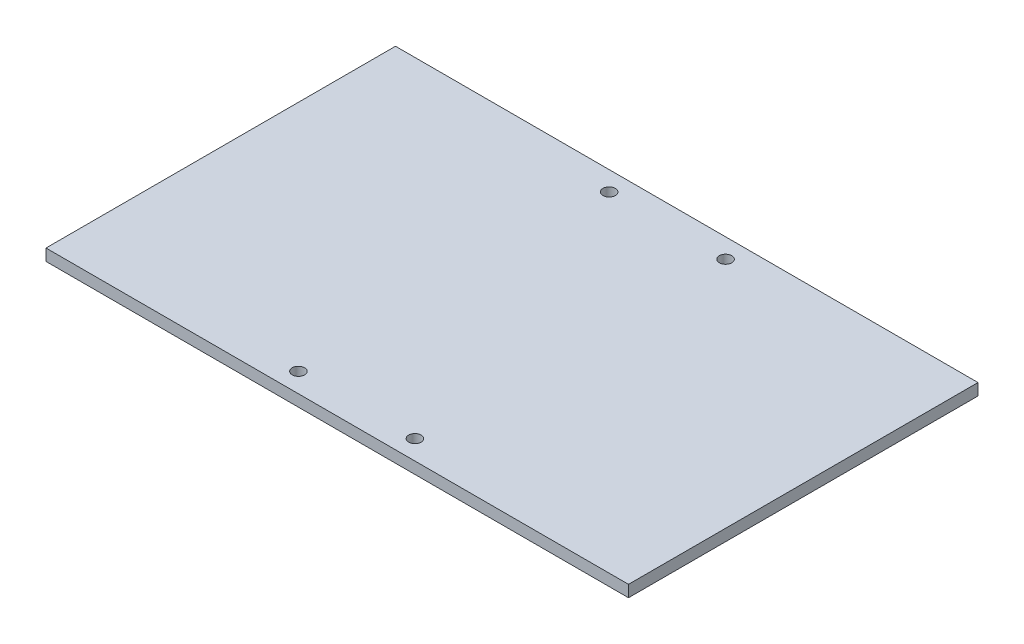
ISO-10303-21;
HEADER;
FILE_DESCRIPTION(('STEP AP214'),'2;1');
FILE_NAME('part.step','',(''),(''),'','','');
FILE_SCHEMA(('AUTOMOTIVE_DESIGN { 1 0 10303 214 1 1 1 1 }'));
ENDSEC;
DATA;
#1=APPLICATION_CONTEXT('core data for automotive mechanical design processes');
#2=APPLICATION_PROTOCOL_DEFINITION('international standard','automotive_design',2000,#1);
#3=PRODUCT_CONTEXT('',#1,'mechanical');
#4=PRODUCT('Part','Part','',(#3));
#5=PRODUCT_RELATED_PRODUCT_CATEGORY('part','',(#4));
#6=PRODUCT_DEFINITION_FORMATION('','',#4);
#7=PRODUCT_DEFINITION_CONTEXT('part definition',#1,'design');
#8=PRODUCT_DEFINITION('design','',#6,#7);
#9=PRODUCT_DEFINITION_SHAPE('','',#8);
#10=(LENGTH_UNIT() NAMED_UNIT(*) SI_UNIT(.MILLI.,.METRE.));
#11=(NAMED_UNIT(*) PLANE_ANGLE_UNIT() SI_UNIT($,.RADIAN.));
#12=(NAMED_UNIT(*) SI_UNIT($,.STERADIAN.) SOLID_ANGLE_UNIT());
#13=UNCERTAINTY_MEASURE_WITH_UNIT(LENGTH_MEASURE(1.E-05),#10,'distance_accuracy_value','');
#14=(GEOMETRIC_REPRESENTATION_CONTEXT(3) GLOBAL_UNCERTAINTY_ASSIGNED_CONTEXT((#13)) GLOBAL_UNIT_ASSIGNED_CONTEXT((#10,
#11,#12)) REPRESENTATION_CONTEXT('',''));
#15=CARTESIAN_POINT('',(0.,0.,0.));
#16=DIRECTION('',(0.,0.,1.));
#17=DIRECTION('',(1.,0.,0.));
#18=AXIS2_PLACEMENT_3D('',#15,#16,#17);
#19=CARTESIAN_POINT('',(0.,3.,0.));
#20=DIRECTION('',(0.,1.,0.));
#21=DIRECTION('',(0.,0.,1.));
#22=AXIS2_PLACEMENT_3D('',#19,#20,#21);
#23=PLANE('',#22);
#24=CARTESIAN_POINT('',(-15.,3.,40.));
#25=DIRECTION('',(0.,1.,0.));
#26=DIRECTION('',(0.,0.,1.));
#27=AXIS2_PLACEMENT_3D('',#24,#25,#26);
#28=CIRCLE('',#27,1.6);
#29=CARTESIAN_POINT('',(-15.,3.,41.6));
#30=VERTEX_POINT('',#29);
#31=EDGE_CURVE('E130',#30,#30,#28,.T.);
#32=ORIENTED_EDGE('',*,*,#31,.F.);
#33=EDGE_LOOP('',(#32));
#34=FACE_BOUND('',#33,.T.);
#35=CARTESIAN_POINT('',(15.,3.,40.));
#36=DIRECTION('',(0.,1.,0.));
#37=DIRECTION('',(0.,0.,1.));
#38=AXIS2_PLACEMENT_3D('',#35,#36,#37);
#39=CIRCLE('',#38,1.6);
#40=CARTESIAN_POINT('',(15.,3.,41.6));
#41=VERTEX_POINT('',#40);
#42=EDGE_CURVE('E106',#41,#41,#39,.T.);
#43=ORIENTED_EDGE('',*,*,#42,.F.);
#44=EDGE_LOOP('',(#43));
#45=FACE_BOUND('',#44,.T.);
#46=DIRECTION('',(0.,0.,-1.));
#47=VECTOR('',#46,1.);
#48=CARTESIAN_POINT('',(75.,3.,-45.));
#49=LINE('',#48,#47);
#50=CARTESIAN_POINT('',(75.,3.,45.));
#51=VERTEX_POINT('',#50);
#52=CARTESIAN_POINT('',(75.,3.,-45.));
#53=VERTEX_POINT('',#52);
#54=EDGE_CURVE('E91',#51,#53,#49,.T.);
#55=ORIENTED_EDGE('',*,*,#54,.T.);
#56=DIRECTION('',(-1.,0.,0.));
#57=VECTOR('',#56,1.);
#58=CARTESIAN_POINT('',(-75.,3.,-45.));
#59=LINE('',#58,#57);
#60=CARTESIAN_POINT('',(-75.,3.,-45.));
#61=VERTEX_POINT('',#60);
#62=EDGE_CURVE('E86',#53,#61,#59,.T.);
#63=ORIENTED_EDGE('',*,*,#62,.T.);
#64=DIRECTION('',(0.,0.,1.));
#65=VECTOR('',#64,1.);
#66=CARTESIAN_POINT('',(-75.,3.,-45.));
#67=LINE('',#66,#65);
#68=CARTESIAN_POINT('',(-75.,3.,45.));
#69=VERTEX_POINT('',#68);
#70=EDGE_CURVE('E87',#61,#69,#67,.T.);
#71=ORIENTED_EDGE('',*,*,#70,.T.);
#72=DIRECTION('',(1.,0.,0.));
#73=VECTOR('',#72,1.);
#74=CARTESIAN_POINT('',(-75.,3.,45.));
#75=LINE('',#74,#73);
#76=EDGE_CURVE('E57',#69,#51,#75,.T.);
#77=ORIENTED_EDGE('',*,*,#76,.T.);
#78=EDGE_LOOP('',(#55,#63,#71,#77));
#79=FACE_BOUND('',#78,.T.);
#80=CARTESIAN_POINT('',(-15.,3.,-40.));
#81=DIRECTION('',(0.,1.,0.));
#82=DIRECTION('',(0.,0.,1.));
#83=AXIS2_PLACEMENT_3D('',#80,#81,#82);
#84=CIRCLE('',#83,1.6);
#85=CARTESIAN_POINT('',(-15.,3.,-38.4));
#86=VERTEX_POINT('',#85);
#87=EDGE_CURVE('E123',#86,#86,#84,.T.);
#88=ORIENTED_EDGE('',*,*,#87,.F.);
#89=EDGE_LOOP('',(#88));
#90=FACE_BOUND('',#89,.T.);
#91=CARTESIAN_POINT('',(15.,3.,-40.));
#92=DIRECTION('',(0.,1.,0.));
#93=DIRECTION('',(0.,0.,1.));
#94=AXIS2_PLACEMENT_3D('',#91,#92,#93);
#95=CIRCLE('',#94,1.6);
#96=CARTESIAN_POINT('',(15.,3.,-38.4));
#97=VERTEX_POINT('',#96);
#98=EDGE_CURVE('E133',#97,#97,#95,.T.);
#99=ORIENTED_EDGE('',*,*,#98,.F.);
#100=EDGE_LOOP('',(#99));
#101=FACE_BOUND('',#100,.T.);
#102=ADVANCED_FACE('F39',(#34,#45,#79,#90,#101),#23,.T.);
#103=CARTESIAN_POINT('',(0.,0.,0.));
#104=DIRECTION('',(0.,1.,0.));
#105=DIRECTION('',(0.,0.,1.));
#106=AXIS2_PLACEMENT_3D('',#103,#104,#105);
#107=PLANE('',#106);
#108=DIRECTION('',(0.,0.,-1.));
#109=VECTOR('',#108,1.);
#110=CARTESIAN_POINT('',(75.,0.,-45.));
#111=LINE('',#110,#109);
#112=CARTESIAN_POINT('',(75.,0.,45.));
#113=VERTEX_POINT('',#112);
#114=CARTESIAN_POINT('',(75.,0.,-45.));
#115=VERTEX_POINT('',#114);
#116=EDGE_CURVE('E104',#113,#115,#111,.T.);
#117=ORIENTED_EDGE('',*,*,#116,.F.);
#118=DIRECTION('',(1.,0.,0.));
#119=VECTOR('',#118,1.);
#120=CARTESIAN_POINT('',(-75.,0.,45.));
#121=LINE('',#120,#119);
#122=CARTESIAN_POINT('',(-75.,0.,45.));
#123=VERTEX_POINT('',#122);
#124=EDGE_CURVE('E80',#123,#113,#121,.T.);
#125=ORIENTED_EDGE('',*,*,#124,.F.);
#126=DIRECTION('',(0.,0.,1.));
#127=VECTOR('',#126,1.);
#128=CARTESIAN_POINT('',(-75.,0.,-45.));
#129=LINE('',#128,#127);
#130=CARTESIAN_POINT('',(-75.,0.,-45.));
#131=VERTEX_POINT('',#130);
#132=EDGE_CURVE('E74',#131,#123,#129,.T.);
#133=ORIENTED_EDGE('',*,*,#132,.F.);
#134=DIRECTION('',(-1.,0.,0.));
#135=VECTOR('',#134,1.);
#136=CARTESIAN_POINT('',(-75.,0.,-45.));
#137=LINE('',#136,#135);
#138=EDGE_CURVE('E94',#115,#131,#137,.T.);
#139=ORIENTED_EDGE('',*,*,#138,.F.);
#140=EDGE_LOOP('',(#117,#125,#133,#139));
#141=FACE_BOUND('',#140,.T.);
#142=CARTESIAN_POINT('',(15.,0.,40.));
#143=DIRECTION('',(0.,1.,0.));
#144=DIRECTION('',(0.,0.,1.));
#145=AXIS2_PLACEMENT_3D('',#142,#143,#144);
#146=CIRCLE('',#145,1.6);
#147=CARTESIAN_POINT('',(15.,0.,41.6));
#148=VERTEX_POINT('',#147);
#149=EDGE_CURVE('E119',#148,#148,#146,.T.);
#150=ORIENTED_EDGE('',*,*,#149,.T.);
#151=EDGE_LOOP('',(#150));
#152=FACE_BOUND('',#151,.T.);
#153=CARTESIAN_POINT('',(-15.,0.,-40.));
#154=DIRECTION('',(0.,1.,0.));
#155=DIRECTION('',(0.,0.,1.));
#156=AXIS2_PLACEMENT_3D('',#153,#154,#155);
#157=CIRCLE('',#156,1.6);
#158=CARTESIAN_POINT('',(-15.,0.,-38.4));
#159=VERTEX_POINT('',#158);
#160=EDGE_CURVE('E125',#159,#159,#157,.T.);
#161=ORIENTED_EDGE('',*,*,#160,.T.);
#162=EDGE_LOOP('',(#161));
#163=FACE_BOUND('',#162,.T.);
#164=CARTESIAN_POINT('',(-15.,0.,40.));
#165=DIRECTION('',(0.,1.,0.));
#166=DIRECTION('',(0.,0.,1.));
#167=AXIS2_PLACEMENT_3D('',#164,#165,#166);
#168=CIRCLE('',#167,1.6);
#169=CARTESIAN_POINT('',(-15.,0.,41.6));
#170=VERTEX_POINT('',#169);
#171=EDGE_CURVE('E127',#170,#170,#168,.T.);
#172=ORIENTED_EDGE('',*,*,#171,.T.);
#173=EDGE_LOOP('',(#172));
#174=FACE_BOUND('',#173,.T.);
#175=CARTESIAN_POINT('',(15.,0.,-40.));
#176=DIRECTION('',(0.,1.,0.));
#177=DIRECTION('',(0.,0.,1.));
#178=AXIS2_PLACEMENT_3D('',#175,#176,#177);
#179=CIRCLE('',#178,1.6);
#180=CARTESIAN_POINT('',(15.,0.,-38.4));
#181=VERTEX_POINT('',#180);
#182=EDGE_CURVE('E136',#181,#181,#179,.T.);
#183=ORIENTED_EDGE('',*,*,#182,.T.);
#184=EDGE_LOOP('',(#183));
#185=FACE_BOUND('',#184,.T.);
#186=ADVANCED_FACE('F114',(#141,#152,#163,#174,#185),#107,.F.);
#187=CARTESIAN_POINT('',(75.,3.,-45.));
#188=DIRECTION('',(-1.,0.,0.));
#189=DIRECTION('',(0.,0.,1.));
#190=AXIS2_PLACEMENT_3D('',#187,#188,#189);
#191=PLANE('',#190);
#192=ORIENTED_EDGE('',*,*,#116,.T.);
#193=DIRECTION('',(0.,-1.,0.));
#194=VECTOR('',#193,1.);
#195=CARTESIAN_POINT('',(75.,3.,-45.));
#196=LINE('',#195,#194);
#197=EDGE_CURVE('E11',#53,#115,#196,.T.);
#198=ORIENTED_EDGE('',*,*,#197,.F.);
#199=ORIENTED_EDGE('',*,*,#54,.F.);
#200=DIRECTION('',(0.,-1.,0.));
#201=VECTOR('',#200,1.);
#202=CARTESIAN_POINT('',(75.,3.,45.));
#203=LINE('',#202,#201);
#204=EDGE_CURVE('E98',#51,#113,#203,.T.);
#205=ORIENTED_EDGE('',*,*,#204,.T.);
#206=EDGE_LOOP('',(#192,#198,#199,#205));
#207=FACE_BOUND('',#206,.T.);
#208=ADVANCED_FACE('F41',(#207),#191,.F.);
#209=CARTESIAN_POINT('',(-75.,3.,-45.));
#210=DIRECTION('',(0.,0.,1.));
#211=DIRECTION('',(1.,0.,0.));
#212=AXIS2_PLACEMENT_3D('',#209,#210,#211);
#213=PLANE('',#212);
#214=ORIENTED_EDGE('',*,*,#138,.T.);
#215=DIRECTION('',(0.,-1.,0.));
#216=VECTOR('',#215,1.);
#217=CARTESIAN_POINT('',(-75.,3.,-45.));
#218=LINE('',#217,#216);
#219=EDGE_CURVE('E48',#61,#131,#218,.T.);
#220=ORIENTED_EDGE('',*,*,#219,.F.);
#221=ORIENTED_EDGE('',*,*,#62,.F.);
#222=ORIENTED_EDGE('',*,*,#197,.T.);
#223=EDGE_LOOP('',(#214,#220,#221,#222));
#224=FACE_BOUND('',#223,.T.);
#225=ADVANCED_FACE('F92',(#224),#213,.F.);
#226=CARTESIAN_POINT('',(-75.,3.,-45.));
#227=DIRECTION('',(1.,0.,0.));
#228=DIRECTION('',(0.,0.,-1.));
#229=AXIS2_PLACEMENT_3D('',#226,#227,#228);
#230=PLANE('',#229);
#231=ORIENTED_EDGE('',*,*,#132,.T.);
#232=DIRECTION('',(0.,-1.,0.));
#233=VECTOR('',#232,1.);
#234=CARTESIAN_POINT('',(-75.,3.,45.));
#235=LINE('',#234,#233);
#236=EDGE_CURVE('E96',#69,#123,#235,.T.);
#237=ORIENTED_EDGE('',*,*,#236,.F.);
#238=ORIENTED_EDGE('',*,*,#70,.F.);
#239=ORIENTED_EDGE('',*,*,#219,.T.);
#240=EDGE_LOOP('',(#231,#237,#238,#239));
#241=FACE_BOUND('',#240,.T.);
#242=ADVANCED_FACE('F100',(#241),#230,.F.);
#243=CARTESIAN_POINT('',(-75.,3.,45.));
#244=DIRECTION('',(0.,0.,-1.));
#245=DIRECTION('',(-1.,0.,0.));
#246=AXIS2_PLACEMENT_3D('',#243,#244,#245);
#247=PLANE('',#246);
#248=ORIENTED_EDGE('',*,*,#124,.T.);
#249=ORIENTED_EDGE('',*,*,#204,.F.);
#250=ORIENTED_EDGE('',*,*,#76,.F.);
#251=ORIENTED_EDGE('',*,*,#236,.T.);
#252=EDGE_LOOP('',(#248,#249,#250,#251));
#253=FACE_BOUND('',#252,.T.);
#254=ADVANCED_FACE('F112',(#253),#247,.F.);
#255=CARTESIAN_POINT('',(15.,3.,40.));
#256=DIRECTION('',(0.,-1.,0.));
#257=DIRECTION('',(0.,0.,-1.));
#258=AXIS2_PLACEMENT_3D('',#255,#256,#257);
#259=CYLINDRICAL_SURFACE('',#258,1.6);
#260=ORIENTED_EDGE('',*,*,#42,.T.);
#261=EDGE_LOOP('',(#260));
#262=FACE_BOUND('',#261,.T.);
#263=ORIENTED_EDGE('',*,*,#149,.F.);
#264=EDGE_LOOP('',(#263));
#265=FACE_BOUND('',#264,.T.);
#266=ADVANCED_FACE('F155',(#262,#265),#259,.F.);
#267=CARTESIAN_POINT('',(-15.,3.,-40.));
#268=DIRECTION('',(0.,-1.,0.));
#269=DIRECTION('',(0.,0.,-1.));
#270=AXIS2_PLACEMENT_3D('',#267,#268,#269);
#271=CYLINDRICAL_SURFACE('',#270,1.6);
#272=ORIENTED_EDGE('',*,*,#87,.T.);
#273=EDGE_LOOP('',(#272));
#274=FACE_BOUND('',#273,.T.);
#275=ORIENTED_EDGE('',*,*,#160,.F.);
#276=EDGE_LOOP('',(#275));
#277=FACE_BOUND('',#276,.T.);
#278=ADVANCED_FACE('F200',(#274,#277),#271,.F.);
#279=CARTESIAN_POINT('',(-15.,3.,40.));
#280=DIRECTION('',(0.,-1.,0.));
#281=DIRECTION('',(0.,0.,-1.));
#282=AXIS2_PLACEMENT_3D('',#279,#280,#281);
#283=CYLINDRICAL_SURFACE('',#282,1.6);
#284=ORIENTED_EDGE('',*,*,#31,.T.);
#285=EDGE_LOOP('',(#284));
#286=FACE_BOUND('',#285,.T.);
#287=ORIENTED_EDGE('',*,*,#171,.F.);
#288=EDGE_LOOP('',(#287));
#289=FACE_BOUND('',#288,.T.);
#290=ADVANCED_FACE('F209',(#286,#289),#283,.F.);
#291=CARTESIAN_POINT('',(15.,3.,-40.));
#292=DIRECTION('',(0.,-1.,0.));
#293=DIRECTION('',(0.,0.,-1.));
#294=AXIS2_PLACEMENT_3D('',#291,#292,#293);
#295=CYLINDRICAL_SURFACE('',#294,1.6);
#296=ORIENTED_EDGE('',*,*,#98,.T.);
#297=EDGE_LOOP('',(#296));
#298=FACE_BOUND('',#297,.T.);
#299=ORIENTED_EDGE('',*,*,#182,.F.);
#300=EDGE_LOOP('',(#299));
#301=FACE_BOUND('',#300,.T.);
#302=ADVANCED_FACE('F145',(#298,#301),#295,.F.);
#303=CLOSED_SHELL('',(#102,#186,#208,#225,#242,#254,#266,#278,#290,#302));
#304=MANIFOLD_SOLID_BREP('B2',#303);
#305=ADVANCED_BREP_SHAPE_REPRESENTATION('',(#18,#304),#14);
#306=SHAPE_DEFINITION_REPRESENTATION(#9,#305);
ENDSEC;
END-ISO-10303-21;
